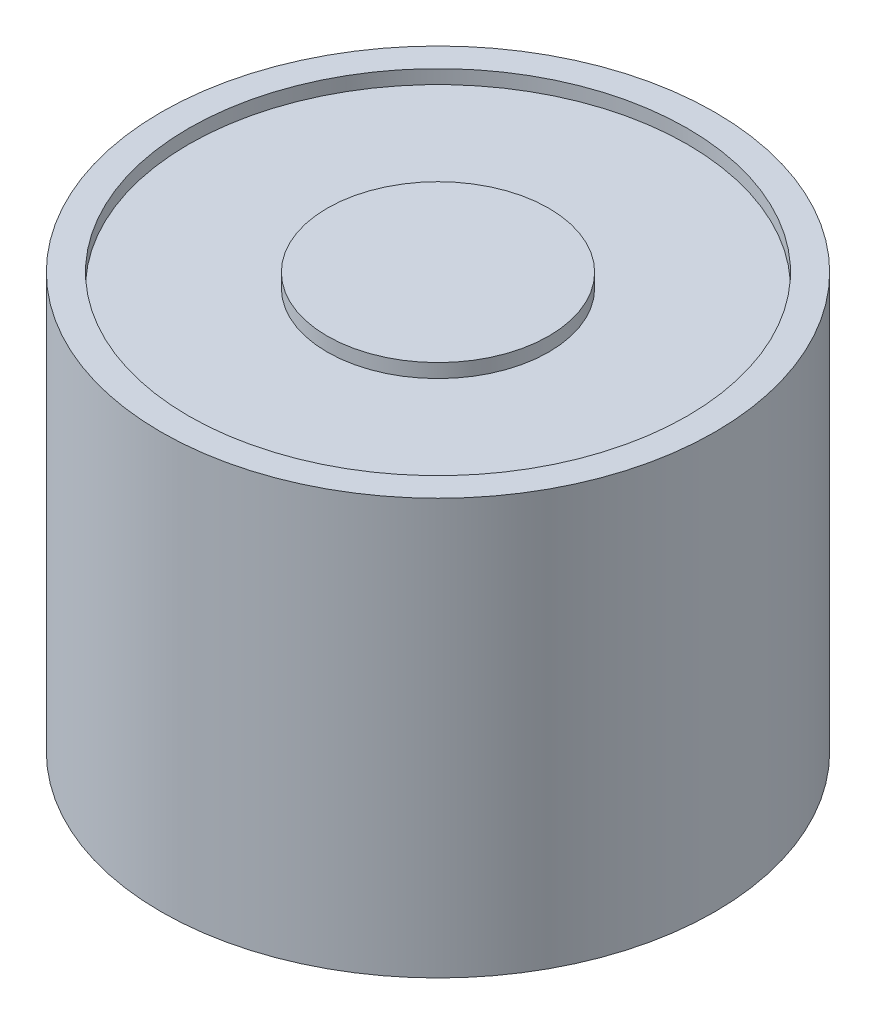
ISO-10303-21;
HEADER;
FILE_DESCRIPTION(('STEP AP214'),'2;1');
FILE_NAME('part.step','',(''),(''),'','','');
FILE_SCHEMA(('AUTOMOTIVE_DESIGN { 1 0 10303 214 1 1 1 1 }'));
ENDSEC;
DATA;
#1=APPLICATION_CONTEXT('core data for automotive mechanical design processes');
#2=APPLICATION_PROTOCOL_DEFINITION('international standard','automotive_design',2000,#1);
#3=PRODUCT_CONTEXT('',#1,'mechanical');
#4=PRODUCT('Part','Part','',(#3));
#5=PRODUCT_RELATED_PRODUCT_CATEGORY('part','',(#4));
#6=PRODUCT_DEFINITION_FORMATION('','',#4);
#7=PRODUCT_DEFINITION_CONTEXT('part definition',#1,'design');
#8=PRODUCT_DEFINITION('design','',#6,#7);
#9=PRODUCT_DEFINITION_SHAPE('','',#8);
#10=(LENGTH_UNIT() NAMED_UNIT(*) SI_UNIT(.MILLI.,.METRE.));
#11=(NAMED_UNIT(*) PLANE_ANGLE_UNIT() SI_UNIT($,.RADIAN.));
#12=(NAMED_UNIT(*) SI_UNIT($,.STERADIAN.) SOLID_ANGLE_UNIT());
#13=UNCERTAINTY_MEASURE_WITH_UNIT(LENGTH_MEASURE(1.E-05),#10,'distance_accuracy_value','');
#14=(GEOMETRIC_REPRESENTATION_CONTEXT(3) GLOBAL_UNCERTAINTY_ASSIGNED_CONTEXT((#13)) GLOBAL_UNIT_ASSIGNED_CONTEXT((#10,
#11,#12)) REPRESENTATION_CONTEXT('',''));
#15=CARTESIAN_POINT('',(0.,0.,0.));
#16=DIRECTION('',(0.,0.,1.));
#17=DIRECTION('',(1.,0.,0.));
#18=AXIS2_PLACEMENT_3D('',#15,#16,#17);
#19=CARTESIAN_POINT('',(0.,15.,0.));
#20=DIRECTION('',(0.,-1.,0.));
#21=DIRECTION('',(0.,0.,-1.));
#22=AXIS2_PLACEMENT_3D('',#19,#20,#21);
#23=CYLINDRICAL_SURFACE('',#22,10.);
#24=CARTESIAN_POINT('',(0.,15.,0.));
#25=DIRECTION('',(0.,1.,0.));
#26=DIRECTION('',(0.,0.,1.));
#27=AXIS2_PLACEMENT_3D('',#24,#25,#26);
#28=CIRCLE('',#27,10.);
#29=CARTESIAN_POINT('',(0.,15.,10.));
#30=VERTEX_POINT('',#29);
#31=EDGE_CURVE('E11',#30,#30,#28,.T.);
#32=ORIENTED_EDGE('',*,*,#31,.F.);
#33=EDGE_LOOP('',(#32));
#34=FACE_BOUND('',#33,.T.);
#35=CARTESIAN_POINT('',(0.,0.,0.));
#36=DIRECTION('',(0.,1.,0.));
#37=DIRECTION('',(0.,0.,1.));
#38=AXIS2_PLACEMENT_3D('',#35,#36,#37);
#39=CIRCLE('',#38,10.);
#40=CARTESIAN_POINT('',(0.,0.,10.));
#41=VERTEX_POINT('',#40);
#42=EDGE_CURVE('E48',#41,#41,#39,.T.);
#43=ORIENTED_EDGE('',*,*,#42,.T.);
#44=EDGE_LOOP('',(#43));
#45=FACE_BOUND('',#44,.T.);
#46=ADVANCED_FACE('F45',(#34,#45),#23,.T.);
#47=CARTESIAN_POINT('',(0.,15.,0.));
#48=DIRECTION('',(0.,1.,0.));
#49=DIRECTION('',(0.,0.,1.));
#50=AXIS2_PLACEMENT_3D('',#47,#48,#49);
#51=PLANE('',#50);
#52=CARTESIAN_POINT('',(0.,15.,0.));
#53=DIRECTION('',(0.,1.,0.));
#54=DIRECTION('',(0.,0.,1.));
#55=AXIS2_PLACEMENT_3D('',#52,#53,#54);
#56=CIRCLE('',#55,9.);
#57=CARTESIAN_POINT('',(0.,15.,9.));
#58=VERTEX_POINT('',#57);
#59=EDGE_CURVE('E79',#58,#58,#56,.T.);
#60=ORIENTED_EDGE('',*,*,#59,.F.);
#61=EDGE_LOOP('',(#60));
#62=FACE_BOUND('',#61,.T.);
#63=ORIENTED_EDGE('',*,*,#31,.T.);
#64=EDGE_LOOP('',(#63));
#65=FACE_BOUND('',#64,.T.);
#66=ADVANCED_FACE('F91',(#62,#65),#51,.T.);
#67=CARTESIAN_POINT('',(0.,0.,0.));
#68=DIRECTION('',(0.,1.,0.));
#69=DIRECTION('',(0.,0.,1.));
#70=AXIS2_PLACEMENT_3D('',#67,#68,#69);
#71=PLANE('',#70);
#72=CARTESIAN_POINT('',(0.,0.,0.));
#73=DIRECTION('',(0.,-1.,0.));
#74=DIRECTION('',(0.,0.,-1.));
#75=AXIS2_PLACEMENT_3D('',#72,#73,#74);
#76=CIRCLE('',#75,1.025);
#77=CARTESIAN_POINT('',(0.,0.,-1.025));
#78=VERTEX_POINT('',#77);
#79=EDGE_CURVE('E67',#78,#78,#76,.T.);
#80=ORIENTED_EDGE('',*,*,#79,.F.);
#81=EDGE_LOOP('',(#80));
#82=FACE_BOUND('',#81,.T.);
#83=ORIENTED_EDGE('',*,*,#42,.F.);
#84=EDGE_LOOP('',(#83));
#85=FACE_BOUND('',#84,.T.);
#86=ADVANCED_FACE('F94',(#82,#85),#71,.F.);
#87=CARTESIAN_POINT('',(0.,14.5,0.));
#88=DIRECTION('',(0.,1.,0.));
#89=DIRECTION('',(0.,0.,1.));
#90=AXIS2_PLACEMENT_3D('',#87,#88,#89);
#91=CYLINDRICAL_SURFACE('',#90,9.);
#92=CARTESIAN_POINT('',(0.,14.5,0.));
#93=DIRECTION('',(0.,1.,0.));
#94=DIRECTION('',(0.,0.,1.));
#95=AXIS2_PLACEMENT_3D('',#92,#93,#94);
#96=CIRCLE('',#95,9.);
#97=CARTESIAN_POINT('',(0.,14.5,9.));
#98=VERTEX_POINT('',#97);
#99=EDGE_CURVE('E81',#98,#98,#96,.T.);
#100=ORIENTED_EDGE('',*,*,#99,.F.);
#101=EDGE_LOOP('',(#100));
#102=FACE_BOUND('',#101,.T.);
#103=ORIENTED_EDGE('',*,*,#59,.T.);
#104=EDGE_LOOP('',(#103));
#105=FACE_BOUND('',#104,.T.);
#106=ADVANCED_FACE('F89',(#102,#105),#91,.F.);
#107=CARTESIAN_POINT('',(0.,14.5,0.));
#108=DIRECTION('',(0.,1.,0.));
#109=DIRECTION('',(0.,0.,1.));
#110=AXIS2_PLACEMENT_3D('',#107,#108,#109);
#111=PLANE('',#110);
#112=CARTESIAN_POINT('',(0.,14.5,0.));
#113=DIRECTION('',(0.,1.,0.));
#114=DIRECTION('',(0.,0.,1.));
#115=AXIS2_PLACEMENT_3D('',#112,#113,#114);
#116=CIRCLE('',#115,4.);
#117=CARTESIAN_POINT('',(0.,14.5,4.));
#118=VERTEX_POINT('',#117);
#119=EDGE_CURVE('E72',#118,#118,#116,.T.);
#120=ORIENTED_EDGE('',*,*,#119,.F.);
#121=EDGE_LOOP('',(#120));
#122=FACE_BOUND('',#121,.T.);
#123=ORIENTED_EDGE('',*,*,#99,.T.);
#124=EDGE_LOOP('',(#123));
#125=FACE_BOUND('',#124,.T.);
#126=ADVANCED_FACE('F109',(#122,#125),#111,.T.);
#127=CARTESIAN_POINT('',(0.,14.5,0.));
#128=DIRECTION('',(0.,1.,0.));
#129=DIRECTION('',(0.,0.,1.));
#130=AXIS2_PLACEMENT_3D('',#127,#128,#129);
#131=CYLINDRICAL_SURFACE('',#130,4.);
#132=ORIENTED_EDGE('',*,*,#119,.T.);
#133=EDGE_LOOP('',(#132));
#134=FACE_BOUND('',#133,.T.);
#135=CARTESIAN_POINT('',(0.,15.,0.));
#136=DIRECTION('',(0.,1.,0.));
#137=DIRECTION('',(0.,0.,1.));
#138=AXIS2_PLACEMENT_3D('',#135,#136,#137);
#139=CIRCLE('',#138,4.);
#140=CARTESIAN_POINT('',(0.,15.,4.));
#141=VERTEX_POINT('',#140);
#142=EDGE_CURVE('E66',#141,#141,#139,.T.);
#143=ORIENTED_EDGE('',*,*,#142,.F.);
#144=EDGE_LOOP('',(#143));
#145=FACE_BOUND('',#144,.T.);
#146=ADVANCED_FACE('F116',(#134,#145),#131,.T.);
#147=ORIENTED_EDGE('',*,*,#142,.T.);
#148=EDGE_LOOP('',(#147));
#149=FACE_BOUND('',#148,.T.);
#150=ADVANCED_FACE('F59',(#149),#51,.T.);
#151=CARTESIAN_POINT('',(0.,6.35,0.));
#152=DIRECTION('',(0.,-1.,0.));
#153=DIRECTION('',(0.,0.,-1.));
#154=AXIS2_PLACEMENT_3D('',#151,#152,#153);
#155=CONICAL_SURFACE('',#154,1.025,1.02974425867665);
#156=CARTESIAN_POINT('',(0.,6.96588213450325,0.));
#157=VERTEX_POINT('',#156);
#158=VERTEX_LOOP('',#157);
#159=FACE_BOUND('',#158,.T.);
#160=CARTESIAN_POINT('',(0.,6.35,0.));
#161=DIRECTION('',(0.,-1.,0.));
#162=DIRECTION('',(0.,0.,-1.));
#163=AXIS2_PLACEMENT_3D('',#160,#161,#162);
#164=CIRCLE('',#163,1.025);
#165=CARTESIAN_POINT('',(0.,6.35,-1.025));
#166=VERTEX_POINT('',#165);
#167=EDGE_CURVE('E63',#166,#166,#164,.T.);
#168=ORIENTED_EDGE('',*,*,#167,.T.);
#169=EDGE_LOOP('',(#168));
#170=FACE_BOUND('',#169,.T.);
#171=ADVANCED_FACE('F55',(#159,#170),#155,.F.);
#172=CARTESIAN_POINT('',(0.,0.,0.));
#173=DIRECTION('',(0.,-1.,0.));
#174=DIRECTION('',(0.,0.,-1.));
#175=AXIS2_PLACEMENT_3D('',#172,#173,#174);
#176=CYLINDRICAL_SURFACE('',#175,1.025);
#177=ORIENTED_EDGE('',*,*,#167,.F.);
#178=EDGE_LOOP('',(#177));
#179=FACE_BOUND('',#178,.T.);
#180=ORIENTED_EDGE('',*,*,#79,.T.);
#181=EDGE_LOOP('',(#180));
#182=FACE_BOUND('',#181,.T.);
#183=ADVANCED_FACE('F58',(#179,#182),#176,.F.);
#184=CLOSED_SHELL('',(#46,#66,#86,#106,#126,#146,#150,#171,#183));
#185=MANIFOLD_SOLID_BREP('B2',#184);
#186=ADVANCED_BREP_SHAPE_REPRESENTATION('',(#18,#185),#14);
#187=SHAPE_DEFINITION_REPRESENTATION(#9,#186);
ENDSEC;
END-ISO-10303-21;
